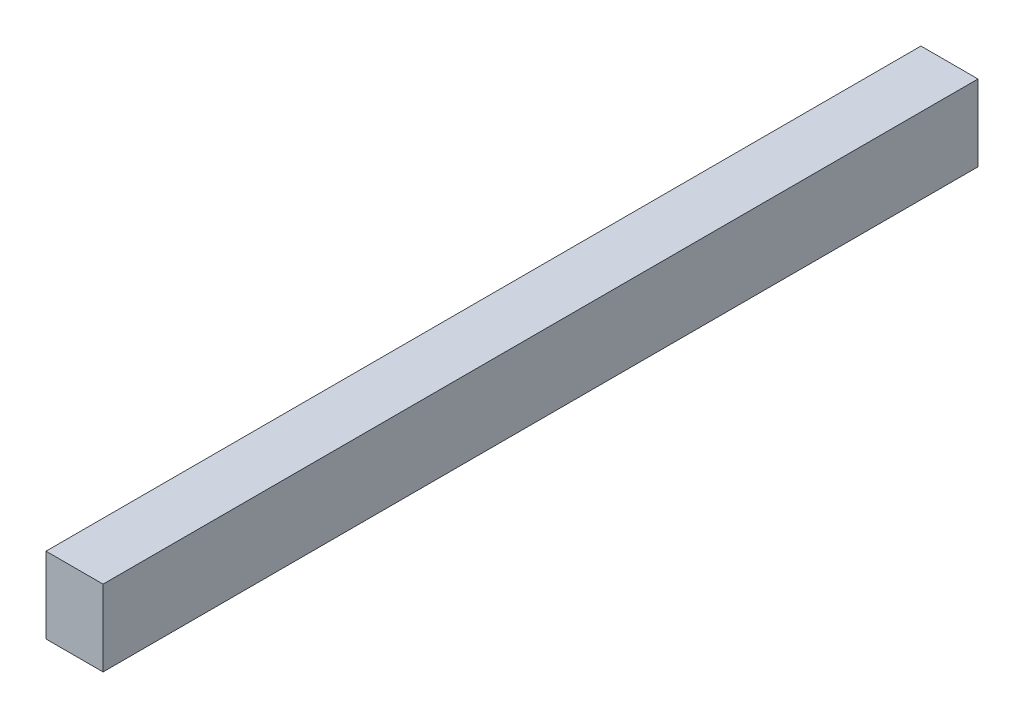
ISO-10303-21;
HEADER;
FILE_DESCRIPTION(('STEP AP214'),'2;1');
FILE_NAME('part.step','',(''),(''),'','','');
FILE_SCHEMA(('AUTOMOTIVE_DESIGN { 1 0 10303 214 1 1 1 1 }'));
ENDSEC;
DATA;
#1=APPLICATION_CONTEXT('core data for automotive mechanical design processes');
#2=APPLICATION_PROTOCOL_DEFINITION('international standard','automotive_design',2000,#1);
#3=PRODUCT_CONTEXT('',#1,'mechanical');
#4=PRODUCT('Part','Part','',(#3));
#5=PRODUCT_RELATED_PRODUCT_CATEGORY('part','',(#4));
#6=PRODUCT_DEFINITION_FORMATION('','',#4);
#7=PRODUCT_DEFINITION_CONTEXT('part definition',#1,'design');
#8=PRODUCT_DEFINITION('design','',#6,#7);
#9=PRODUCT_DEFINITION_SHAPE('','',#8);
#10=(LENGTH_UNIT() NAMED_UNIT(*) SI_UNIT(.MILLI.,.METRE.));
#11=(NAMED_UNIT(*) PLANE_ANGLE_UNIT() SI_UNIT($,.RADIAN.));
#12=(NAMED_UNIT(*) SI_UNIT($,.STERADIAN.) SOLID_ANGLE_UNIT());
#13=UNCERTAINTY_MEASURE_WITH_UNIT(LENGTH_MEASURE(1.E-05),#10,'distance_accuracy_value','');
#14=(GEOMETRIC_REPRESENTATION_CONTEXT(3) GLOBAL_UNCERTAINTY_ASSIGNED_CONTEXT((#13)) GLOBAL_UNIT_ASSIGNED_CONTEXT((#10,
#11,#12)) REPRESENTATION_CONTEXT('',''));
#15=CARTESIAN_POINT('',(0.,0.,0.));
#16=DIRECTION('',(0.,0.,1.));
#17=DIRECTION('',(1.,0.,0.));
#18=AXIS2_PLACEMENT_3D('',#15,#16,#17);
#19=CARTESIAN_POINT('',(-27.6054488102493,33.4498456304373,2300.));
#20=DIRECTION('',(1.,0.,0.));
#21=DIRECTION('',(0.,0.,-1.));
#22=AXIS2_PLACEMENT_3D('',#19,#20,#21);
#23=PLANE('',#22);
#24=DIRECTION('',(0.,-1.,0.));
#25=VECTOR('',#24,1.);
#26=CARTESIAN_POINT('',(-27.6054488102493,33.4498456304373,0.));
#27=LINE('',#26,#25);
#28=CARTESIAN_POINT('',(-27.6054488102493,33.4498456304373,0.));
#29=VERTEX_POINT('',#28);
#30=CARTESIAN_POINT('',(-27.6054488102493,-166.550154369563,0.));
#31=VERTEX_POINT('',#30);
#32=EDGE_CURVE('E96',#29,#31,#27,.T.);
#33=ORIENTED_EDGE('',*,*,#32,.T.);
#34=DIRECTION('',(0.,0.,-1.));
#35=VECTOR('',#34,1.);
#36=CARTESIAN_POINT('',(-27.6054488102493,-166.550154369563,2300.));
#37=LINE('',#36,#35);
#38=CARTESIAN_POINT('',(-27.6054488102493,-166.550154369563,2300.));
#39=VERTEX_POINT('',#38);
#40=EDGE_CURVE('E11',#39,#31,#37,.T.);
#41=ORIENTED_EDGE('',*,*,#40,.F.);
#42=DIRECTION('',(0.,-1.,0.));
#43=VECTOR('',#42,1.);
#44=CARTESIAN_POINT('',(-27.6054488102493,33.4498456304373,2300.));
#45=LINE('',#44,#43);
#46=CARTESIAN_POINT('',(-27.6054488102493,33.4498456304373,2300.));
#47=VERTEX_POINT('',#46);
#48=EDGE_CURVE('E84',#47,#39,#45,.T.);
#49=ORIENTED_EDGE('',*,*,#48,.F.);
#50=DIRECTION('',(0.,0.,-1.));
#51=VECTOR('',#50,1.);
#52=CARTESIAN_POINT('',(-27.6054488102493,33.4498456304373,2300.));
#53=LINE('',#52,#51);
#54=EDGE_CURVE('E92',#47,#29,#53,.T.);
#55=ORIENTED_EDGE('',*,*,#54,.T.);
#56=EDGE_LOOP('',(#33,#41,#49,#55));
#57=FACE_BOUND('',#56,.T.);
#58=ADVANCED_FACE('F33',(#57),#23,.F.);
#59=CARTESIAN_POINT('',(-27.6054488102493,-166.550154369563,2300.));
#60=DIRECTION('',(0.,1.,0.));
#61=DIRECTION('',(0.,0.,1.));
#62=AXIS2_PLACEMENT_3D('',#59,#60,#61);
#63=PLANE('',#62);
#64=DIRECTION('',(1.,0.,0.));
#65=VECTOR('',#64,1.);
#66=CARTESIAN_POINT('',(-27.6054488102493,-166.550154369563,0.));
#67=LINE('',#66,#65);
#68=CARTESIAN_POINT('',(122.394551189751,-166.550154369563,0.));
#69=VERTEX_POINT('',#68);
#70=EDGE_CURVE('E88',#31,#69,#67,.T.);
#71=ORIENTED_EDGE('',*,*,#70,.T.);
#72=DIRECTION('',(0.,0.,-1.));
#73=VECTOR('',#72,1.);
#74=CARTESIAN_POINT('',(122.394551189751,-166.550154369563,2300.));
#75=LINE('',#74,#73);
#76=CARTESIAN_POINT('',(122.394551189751,-166.550154369563,2300.));
#77=VERTEX_POINT('',#76);
#78=EDGE_CURVE('E41',#77,#69,#75,.T.);
#79=ORIENTED_EDGE('',*,*,#78,.F.);
#80=DIRECTION('',(1.,0.,0.));
#81=VECTOR('',#80,1.);
#82=CARTESIAN_POINT('',(-27.6054488102493,-166.550154369563,2300.));
#83=LINE('',#82,#81);
#84=EDGE_CURVE('E79',#39,#77,#83,.T.);
#85=ORIENTED_EDGE('',*,*,#84,.F.);
#86=ORIENTED_EDGE('',*,*,#40,.T.);
#87=EDGE_LOOP('',(#71,#79,#85,#86));
#88=FACE_BOUND('',#87,.T.);
#89=ADVANCED_FACE('F87',(#88),#63,.F.);
#90=CARTESIAN_POINT('',(122.394551189751,33.4498456304373,2300.));
#91=DIRECTION('',(-1.,0.,0.));
#92=DIRECTION('',(0.,0.,1.));
#93=AXIS2_PLACEMENT_3D('',#90,#91,#92);
#94=PLANE('',#93);
#95=DIRECTION('',(0.,1.,0.));
#96=VECTOR('',#95,1.);
#97=CARTESIAN_POINT('',(122.394551189751,33.4498456304373,0.));
#98=LINE('',#97,#96);
#99=CARTESIAN_POINT('',(122.394551189751,33.4498456304373,0.));
#100=VERTEX_POINT('',#99);
#101=EDGE_CURVE('E66',#69,#100,#98,.T.);
#102=ORIENTED_EDGE('',*,*,#101,.T.);
#103=DIRECTION('',(0.,0.,-1.));
#104=VECTOR('',#103,1.);
#105=CARTESIAN_POINT('',(122.394551189751,33.4498456304373,2300.));
#106=LINE('',#105,#104);
#107=CARTESIAN_POINT('',(122.394551189751,33.4498456304373,2300.));
#108=VERTEX_POINT('',#107);
#109=EDGE_CURVE('E89',#108,#100,#106,.T.);
#110=ORIENTED_EDGE('',*,*,#109,.F.);
#111=DIRECTION('',(0.,1.,0.));
#112=VECTOR('',#111,1.);
#113=CARTESIAN_POINT('',(122.394551189751,33.4498456304373,2300.));
#114=LINE('',#113,#112);
#115=EDGE_CURVE('E82',#77,#108,#114,.T.);
#116=ORIENTED_EDGE('',*,*,#115,.F.);
#117=ORIENTED_EDGE('',*,*,#78,.T.);
#118=EDGE_LOOP('',(#102,#110,#116,#117));
#119=FACE_BOUND('',#118,.T.);
#120=ADVANCED_FACE('F90',(#119),#94,.F.);
#121=CARTESIAN_POINT('',(-27.6054488102493,33.4498456304373,2300.));
#122=DIRECTION('',(0.,-1.,0.));
#123=DIRECTION('',(0.,0.,-1.));
#124=AXIS2_PLACEMENT_3D('',#121,#122,#123);
#125=PLANE('',#124);
#126=DIRECTION('',(-1.,0.,0.));
#127=VECTOR('',#126,1.);
#128=CARTESIAN_POINT('',(-27.6054488102493,33.4498456304373,0.));
#129=LINE('',#128,#127);
#130=EDGE_CURVE('E72',#100,#29,#129,.T.);
#131=ORIENTED_EDGE('',*,*,#130,.T.);
#132=ORIENTED_EDGE('',*,*,#54,.F.);
#133=DIRECTION('',(-1.,0.,0.));
#134=VECTOR('',#133,1.);
#135=CARTESIAN_POINT('',(-27.6054488102493,33.4498456304373,2300.));
#136=LINE('',#135,#134);
#137=EDGE_CURVE('E49',#108,#47,#136,.T.);
#138=ORIENTED_EDGE('',*,*,#137,.F.);
#139=ORIENTED_EDGE('',*,*,#109,.T.);
#140=EDGE_LOOP('',(#131,#132,#138,#139));
#141=FACE_BOUND('',#140,.T.);
#142=ADVANCED_FACE('F103',(#141),#125,.F.);
#143=CARTESIAN_POINT('',(-27.6054488102493,-166.550154369563,2300.));
#144=DIRECTION('',(0.,0.,1.));
#145=DIRECTION('',(1.,0.,0.));
#146=AXIS2_PLACEMENT_3D('',#143,#144,#145);
#147=PLANE('',#146);
#148=ORIENTED_EDGE('',*,*,#48,.T.);
#149=ORIENTED_EDGE('',*,*,#84,.T.);
#150=ORIENTED_EDGE('',*,*,#115,.T.);
#151=ORIENTED_EDGE('',*,*,#137,.T.);
#152=EDGE_LOOP('',(#148,#149,#150,#151));
#153=FACE_BOUND('',#152,.T.);
#154=ADVANCED_FACE('F80',(#153),#147,.T.);
#155=CARTESIAN_POINT('',(-27.6054488102493,-166.550154369563,0.));
#156=DIRECTION('',(0.,0.,1.));
#157=DIRECTION('',(1.,0.,0.));
#158=AXIS2_PLACEMENT_3D('',#155,#156,#157);
#159=PLANE('',#158);
#160=ORIENTED_EDGE('',*,*,#32,.F.);
#161=ORIENTED_EDGE('',*,*,#130,.F.);
#162=ORIENTED_EDGE('',*,*,#101,.F.);
#163=ORIENTED_EDGE('',*,*,#70,.F.);
#164=EDGE_LOOP('',(#160,#161,#162,#163));
#165=FACE_BOUND('',#164,.T.);
#166=ADVANCED_FACE('F106',(#165),#159,.F.);
#167=CLOSED_SHELL('',(#58,#89,#120,#142,#154,#166));
#168=MANIFOLD_SOLID_BREP('B2',#167);
#169=ADVANCED_BREP_SHAPE_REPRESENTATION('',(#18,#168),#14);
#170=SHAPE_DEFINITION_REPRESENTATION(#9,#169);
ENDSEC;
END-ISO-10303-21;
